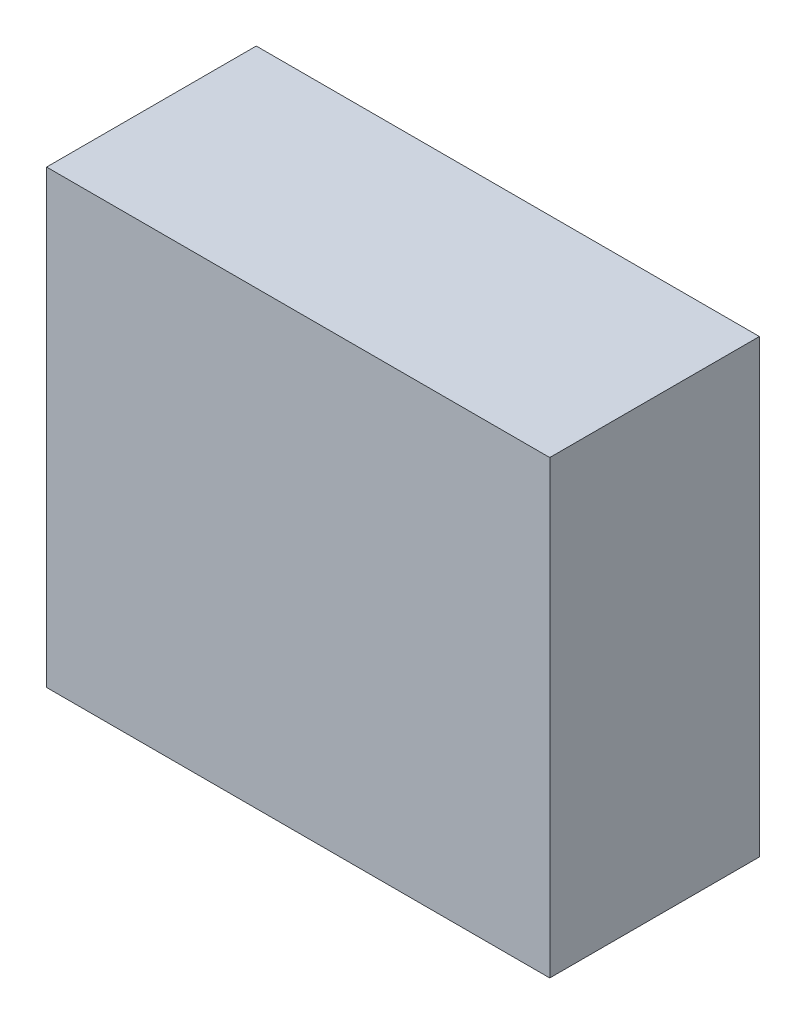
ISO-10303-21;
HEADER;
FILE_DESCRIPTION(('STEP AP214'),'2;1');
FILE_NAME('part.step','',(''),(''),'','','');
FILE_SCHEMA(('AUTOMOTIVE_DESIGN { 1 0 10303 214 1 1 1 1 }'));
ENDSEC;
DATA;
#1=APPLICATION_CONTEXT('core data for automotive mechanical design processes');
#2=APPLICATION_PROTOCOL_DEFINITION('international standard','automotive_design',2000,#1);
#3=PRODUCT_CONTEXT('',#1,'mechanical');
#4=PRODUCT('Part','Part','',(#3));
#5=PRODUCT_RELATED_PRODUCT_CATEGORY('part','',(#4));
#6=PRODUCT_DEFINITION_FORMATION('','',#4);
#7=PRODUCT_DEFINITION_CONTEXT('part definition',#1,'design');
#8=PRODUCT_DEFINITION('design','',#6,#7);
#9=PRODUCT_DEFINITION_SHAPE('','',#8);
#10=(LENGTH_UNIT() NAMED_UNIT(*) SI_UNIT(.MILLI.,.METRE.));
#11=(NAMED_UNIT(*) PLANE_ANGLE_UNIT() SI_UNIT($,.RADIAN.));
#12=(NAMED_UNIT(*) SI_UNIT($,.STERADIAN.) SOLID_ANGLE_UNIT());
#13=UNCERTAINTY_MEASURE_WITH_UNIT(LENGTH_MEASURE(1.E-05),#10,'distance_accuracy_value','');
#14=(GEOMETRIC_REPRESENTATION_CONTEXT(3) GLOBAL_UNCERTAINTY_ASSIGNED_CONTEXT((#13)) GLOBAL_UNIT_ASSIGNED_CONTEXT((#10,
#11,#12)) REPRESENTATION_CONTEXT('',''));
#15=CARTESIAN_POINT('',(0.,0.,0.));
#16=DIRECTION('',(0.,0.,1.));
#17=DIRECTION('',(1.,0.,0.));
#18=AXIS2_PLACEMENT_3D('',#15,#16,#17);
#19=CARTESIAN_POINT('',(240.,430.,100.));
#20=DIRECTION('',(-1.,0.,0.));
#21=DIRECTION('',(0.,0.,1.));
#22=AXIS2_PLACEMENT_3D('',#19,#20,#21);
#23=PLANE('',#22);
#24=DIRECTION('',(0.,0.,-1.));
#25=VECTOR('',#24,1.);
#26=CARTESIAN_POINT('',(240.,0.,100.));
#27=LINE('',#26,#25);
#28=CARTESIAN_POINT('',(240.,0.,100.));
#29=VERTEX_POINT('',#28);
#30=CARTESIAN_POINT('',(240.,0.,-100.));
#31=VERTEX_POINT('',#30);
#32=EDGE_CURVE('E96',#29,#31,#27,.T.);
#33=ORIENTED_EDGE('',*,*,#32,.T.);
#34=DIRECTION('',(0.,-1.,0.));
#35=VECTOR('',#34,1.);
#36=CARTESIAN_POINT('',(240.,430.,-100.));
#37=LINE('',#36,#35);
#38=CARTESIAN_POINT('',(240.,430.,-100.));
#39=VERTEX_POINT('',#38);
#40=EDGE_CURVE('E11',#39,#31,#37,.T.);
#41=ORIENTED_EDGE('',*,*,#40,.F.);
#42=DIRECTION('',(0.,0.,-1.));
#43=VECTOR('',#42,1.);
#44=CARTESIAN_POINT('',(240.,430.,100.));
#45=LINE('',#44,#43);
#46=CARTESIAN_POINT('',(240.,430.,100.));
#47=VERTEX_POINT('',#46);
#48=EDGE_CURVE('E84',#47,#39,#45,.T.);
#49=ORIENTED_EDGE('',*,*,#48,.F.);
#50=DIRECTION('',(0.,-1.,0.));
#51=VECTOR('',#50,1.);
#52=CARTESIAN_POINT('',(240.,430.,100.));
#53=LINE('',#52,#51);
#54=EDGE_CURVE('E92',#47,#29,#53,.T.);
#55=ORIENTED_EDGE('',*,*,#54,.T.);
#56=EDGE_LOOP('',(#33,#41,#49,#55));
#57=FACE_BOUND('',#56,.T.);
#58=ADVANCED_FACE('F33',(#57),#23,.F.);
#59=CARTESIAN_POINT('',(-240.,430.,-100.));
#60=DIRECTION('',(0.,0.,1.));
#61=DIRECTION('',(1.,0.,0.));
#62=AXIS2_PLACEMENT_3D('',#59,#60,#61);
#63=PLANE('',#62);
#64=DIRECTION('',(-1.,0.,0.));
#65=VECTOR('',#64,1.);
#66=CARTESIAN_POINT('',(-240.,0.,-100.));
#67=LINE('',#66,#65);
#68=CARTESIAN_POINT('',(-240.,0.,-100.));
#69=VERTEX_POINT('',#68);
#70=EDGE_CURVE('E88',#31,#69,#67,.T.);
#71=ORIENTED_EDGE('',*,*,#70,.T.);
#72=DIRECTION('',(0.,-1.,0.));
#73=VECTOR('',#72,1.);
#74=CARTESIAN_POINT('',(-240.,430.,-100.));
#75=LINE('',#74,#73);
#76=CARTESIAN_POINT('',(-240.,430.,-100.));
#77=VERTEX_POINT('',#76);
#78=EDGE_CURVE('E41',#77,#69,#75,.T.);
#79=ORIENTED_EDGE('',*,*,#78,.F.);
#80=DIRECTION('',(-1.,0.,0.));
#81=VECTOR('',#80,1.);
#82=CARTESIAN_POINT('',(-240.,430.,-100.));
#83=LINE('',#82,#81);
#84=EDGE_CURVE('E79',#39,#77,#83,.T.);
#85=ORIENTED_EDGE('',*,*,#84,.F.);
#86=ORIENTED_EDGE('',*,*,#40,.T.);
#87=EDGE_LOOP('',(#71,#79,#85,#86));
#88=FACE_BOUND('',#87,.T.);
#89=ADVANCED_FACE('F87',(#88),#63,.F.);
#90=CARTESIAN_POINT('',(-240.,430.,100.));
#91=DIRECTION('',(1.,0.,0.));
#92=DIRECTION('',(0.,0.,-1.));
#93=AXIS2_PLACEMENT_3D('',#90,#91,#92);
#94=PLANE('',#93);
#95=DIRECTION('',(0.,0.,1.));
#96=VECTOR('',#95,1.);
#97=CARTESIAN_POINT('',(-240.,0.,100.));
#98=LINE('',#97,#96);
#99=CARTESIAN_POINT('',(-240.,0.,100.));
#100=VERTEX_POINT('',#99);
#101=EDGE_CURVE('E66',#69,#100,#98,.T.);
#102=ORIENTED_EDGE('',*,*,#101,.T.);
#103=DIRECTION('',(0.,-1.,0.));
#104=VECTOR('',#103,1.);
#105=CARTESIAN_POINT('',(-240.,430.,100.));
#106=LINE('',#105,#104);
#107=CARTESIAN_POINT('',(-240.,430.,100.));
#108=VERTEX_POINT('',#107);
#109=EDGE_CURVE('E89',#108,#100,#106,.T.);
#110=ORIENTED_EDGE('',*,*,#109,.F.);
#111=DIRECTION('',(0.,0.,1.));
#112=VECTOR('',#111,1.);
#113=CARTESIAN_POINT('',(-240.,430.,100.));
#114=LINE('',#113,#112);
#115=EDGE_CURVE('E82',#77,#108,#114,.T.);
#116=ORIENTED_EDGE('',*,*,#115,.F.);
#117=ORIENTED_EDGE('',*,*,#78,.T.);
#118=EDGE_LOOP('',(#102,#110,#116,#117));
#119=FACE_BOUND('',#118,.T.);
#120=ADVANCED_FACE('F90',(#119),#94,.F.);
#121=CARTESIAN_POINT('',(-240.,430.,100.));
#122=DIRECTION('',(0.,0.,-1.));
#123=DIRECTION('',(-1.,0.,0.));
#124=AXIS2_PLACEMENT_3D('',#121,#122,#123);
#125=PLANE('',#124);
#126=DIRECTION('',(1.,0.,0.));
#127=VECTOR('',#126,1.);
#128=CARTESIAN_POINT('',(-240.,0.,100.));
#129=LINE('',#128,#127);
#130=EDGE_CURVE('E72',#100,#29,#129,.T.);
#131=ORIENTED_EDGE('',*,*,#130,.T.);
#132=ORIENTED_EDGE('',*,*,#54,.F.);
#133=DIRECTION('',(1.,0.,0.));
#134=VECTOR('',#133,1.);
#135=CARTESIAN_POINT('',(-240.,430.,100.));
#136=LINE('',#135,#134);
#137=EDGE_CURVE('E49',#108,#47,#136,.T.);
#138=ORIENTED_EDGE('',*,*,#137,.F.);
#139=ORIENTED_EDGE('',*,*,#109,.T.);
#140=EDGE_LOOP('',(#131,#132,#138,#139));
#141=FACE_BOUND('',#140,.T.);
#142=ADVANCED_FACE('F103',(#141),#125,.F.);
#143=CARTESIAN_POINT('',(0.,430.,0.));
#144=DIRECTION('',(0.,-1.,0.));
#145=DIRECTION('',(0.,0.,-1.));
#146=AXIS2_PLACEMENT_3D('',#143,#144,#145);
#147=PLANE('',#146);
#148=ORIENTED_EDGE('',*,*,#48,.T.);
#149=ORIENTED_EDGE('',*,*,#84,.T.);
#150=ORIENTED_EDGE('',*,*,#115,.T.);
#151=ORIENTED_EDGE('',*,*,#137,.T.);
#152=EDGE_LOOP('',(#148,#149,#150,#151));
#153=FACE_BOUND('',#152,.T.);
#154=ADVANCED_FACE('F80',(#153),#147,.F.);
#155=CARTESIAN_POINT('',(0.,0.,0.));
#156=DIRECTION('',(0.,-1.,0.));
#157=DIRECTION('',(0.,0.,-1.));
#158=AXIS2_PLACEMENT_3D('',#155,#156,#157);
#159=PLANE('',#158);
#160=ORIENTED_EDGE('',*,*,#32,.F.);
#161=ORIENTED_EDGE('',*,*,#130,.F.);
#162=ORIENTED_EDGE('',*,*,#101,.F.);
#163=ORIENTED_EDGE('',*,*,#70,.F.);
#164=EDGE_LOOP('',(#160,#161,#162,#163));
#165=FACE_BOUND('',#164,.T.);
#166=ADVANCED_FACE('F106',(#165),#159,.T.);
#167=CLOSED_SHELL('',(#58,#89,#120,#142,#154,#166));
#168=MANIFOLD_SOLID_BREP('B2',#167);
#169=ADVANCED_BREP_SHAPE_REPRESENTATION('',(#18,#168),#14);
#170=SHAPE_DEFINITION_REPRESENTATION(#9,#169);
ENDSEC;
END-ISO-10303-21;
